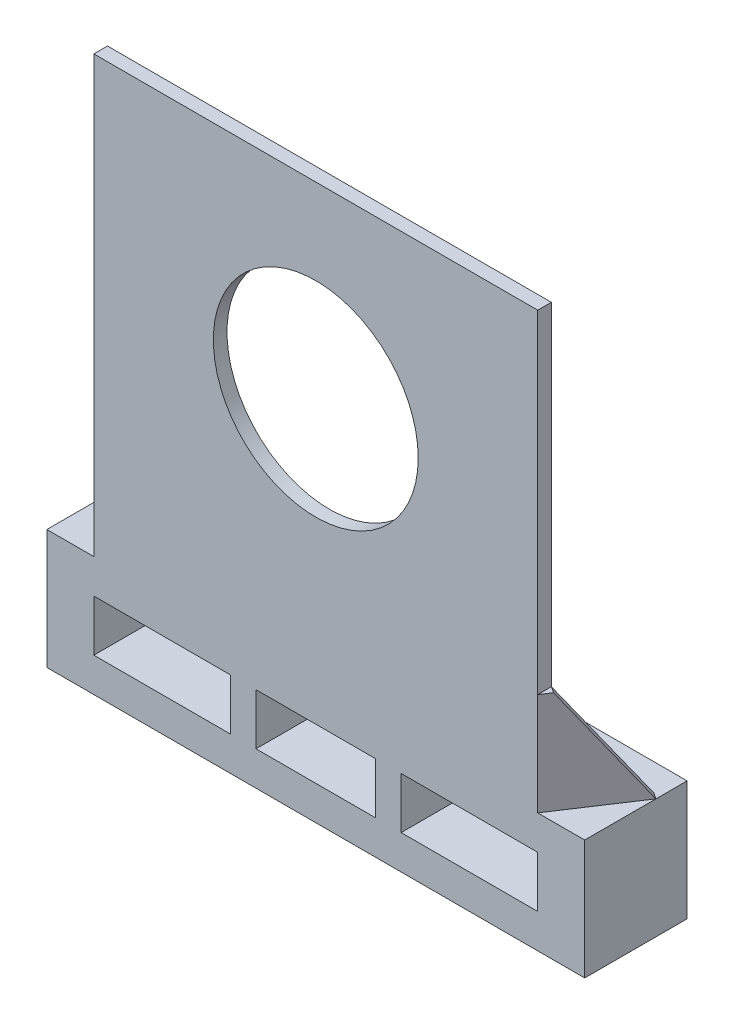
ISO-10303-21;
HEADER;
FILE_DESCRIPTION(('STEP AP214'),'2;1');
FILE_NAME('part.step','',(''),(''),'','','');
FILE_SCHEMA(('AUTOMOTIVE_DESIGN { 1 0 10303 214 1 1 1 1 }'));
ENDSEC;
DATA;
#1=APPLICATION_CONTEXT('core data for automotive mechanical design processes');
#2=APPLICATION_PROTOCOL_DEFINITION('international standard','automotive_design',2000,#1);
#3=PRODUCT_CONTEXT('',#1,'mechanical');
#4=PRODUCT('Part','Part','',(#3));
#5=PRODUCT_RELATED_PRODUCT_CATEGORY('part','',(#4));
#6=PRODUCT_DEFINITION_FORMATION('','',#4);
#7=PRODUCT_DEFINITION_CONTEXT('part definition',#1,'design');
#8=PRODUCT_DEFINITION('design','',#6,#7);
#9=PRODUCT_DEFINITION_SHAPE('','',#8);
#10=(LENGTH_UNIT() NAMED_UNIT(*) SI_UNIT(.MILLI.,.METRE.));
#11=(NAMED_UNIT(*) PLANE_ANGLE_UNIT() SI_UNIT($,.RADIAN.));
#12=(NAMED_UNIT(*) SI_UNIT($,.STERADIAN.) SOLID_ANGLE_UNIT());
#13=UNCERTAINTY_MEASURE_WITH_UNIT(LENGTH_MEASURE(1.E-05),#10,'distance_accuracy_value','');
#14=(GEOMETRIC_REPRESENTATION_CONTEXT(3) GLOBAL_UNCERTAINTY_ASSIGNED_CONTEXT((#13)) GLOBAL_UNIT_ASSIGNED_CONTEXT((#10,
#11,#12)) REPRESENTATION_CONTEXT('',''));
#15=CARTESIAN_POINT('',(0.,0.,0.));
#16=DIRECTION('',(0.,0.,1.));
#17=DIRECTION('',(1.,0.,0.));
#18=AXIS2_PLACEMENT_3D('',#15,#16,#17);
#19=CARTESIAN_POINT('',(-230.737913280798,-101.25,-54.2673490818378));
#20=DIRECTION('',(0.835164654424503,0.,-0.55));
#21=DIRECTION('',(-0.55,0.,-0.835164654424504));
#22=AXIS2_PLACEMENT_3D('',#19,#20,#21);
#23=PLANE('',#22);
#24=DIRECTION('',(0.55,0.,0.835164654424503));
#25=VECTOR('',#24,1.);
#26=CARTESIAN_POINT('',(-230.737913280798,-191.25,-54.2673490818378));
#27=LINE('',#26,#25);
#28=CARTESIAN_POINT('',(-230.737913280798,-191.25,-54.2673490818378));
#29=VERTEX_POINT('',#28);
#30=CARTESIAN_POINT('',(-195.,-191.25,0.));
#31=VERTEX_POINT('',#30);
#32=EDGE_CURVE('E208',#29,#31,#27,.T.);
#33=ORIENTED_EDGE('',*,*,#32,.F.);
#34=DIRECTION('',(0.321948241610948,0.810773184134216,0.488872348995607));
#35=VECTOR('',#34,1.);
#36=CARTESIAN_POINT('',(-207.245483192839,-132.088215949998,-18.594535889107));
#37=LINE('',#36,#35);
#38=CARTESIAN_POINT('',(-195.,-101.25,0.));
#39=VERTEX_POINT('',#38);
#40=EDGE_CURVE('E203',#29,#39,#37,.T.);
#41=ORIENTED_EDGE('',*,*,#40,.T.);
#42=DIRECTION('',(0.,-1.,0.));
#43=VECTOR('',#42,1.);
#44=CARTESIAN_POINT('',(-195.,-101.25,0.));
#45=LINE('',#44,#43);
#46=EDGE_CURVE('E320',#39,#31,#45,.T.);
#47=ORIENTED_EDGE('',*,*,#46,.T.);
#48=EDGE_LOOP('',(#33,#41,#47));
#49=FACE_BOUND('',#48,.T.);
#50=ADVANCED_FACE('F34',(#49),#23,.T.);
#51=CARTESIAN_POINT('',(-195.,-101.25,12.));
#52=DIRECTION('',(-0.835164654424503,0.,0.55));
#53=DIRECTION('',(0.55,0.,0.835164654424503));
#54=AXIS2_PLACEMENT_3D('',#51,#52,#53);
#55=PLANE('',#54);
#56=DIRECTION('',(-0.55,0.,-0.835164654424503));
#57=VECTOR('',#56,1.);
#58=CARTESIAN_POINT('',(-195.,-101.25,12.));
#59=LINE('',#58,#57);
#60=CARTESIAN_POINT('',(-195.,-101.25,12.));
#61=VERTEX_POINT('',#60);
#62=CARTESIAN_POINT('',(-200.512086719202,-101.25,3.62999999999995));
#63=VERTEX_POINT('',#62);
#64=EDGE_CURVE('E217',#61,#63,#59,.T.);
#65=ORIENTED_EDGE('',*,*,#64,.T.);
#66=DIRECTION('',(-0.321948241610948,-0.810773184134216,-0.488872348995607));
#67=VECTOR('',#66,1.);
#68=CARTESIAN_POINT('',(-200.512086719202,-101.25,3.63000000000006));
#69=LINE('',#68,#67);
#70=CARTESIAN_POINT('',(-236.25,-191.25,-50.6373490818377));
#71=VERTEX_POINT('',#70);
#72=EDGE_CURVE('E48',#63,#71,#69,.T.);
#73=ORIENTED_EDGE('',*,*,#72,.T.);
#74=DIRECTION('',(-0.55,0.,-0.835164654424503));
#75=VECTOR('',#74,1.);
#76=CARTESIAN_POINT('',(-195.,-191.25,12.));
#77=LINE('',#76,#75);
#78=CARTESIAN_POINT('',(-195.,-191.25,12.));
#79=VERTEX_POINT('',#78);
#80=EDGE_CURVE('E207',#79,#71,#77,.T.);
#81=ORIENTED_EDGE('',*,*,#80,.F.);
#82=DIRECTION('',(0.,-1.,0.));
#83=VECTOR('',#82,1.);
#84=CARTESIAN_POINT('',(-195.,-101.25,12.));
#85=LINE('',#84,#83);
#86=EDGE_CURVE('E319',#61,#79,#85,.T.);
#87=ORIENTED_EDGE('',*,*,#86,.F.);
#88=EDGE_LOOP('',(#65,#73,#81,#87));
#89=FACE_BOUND('',#88,.T.);
#90=ADVANCED_FACE('F214',(#89),#55,.T.);
#91=CARTESIAN_POINT('',(0.,-101.25,0.));
#92=DIRECTION('',(0.,-1.,0.));
#93=DIRECTION('',(0.,0.,-1.));
#94=AXIS2_PLACEMENT_3D('',#91,#92,#93);
#95=PLANE('',#94);
#96=DIRECTION('',(0.835164654424503,0.,-0.55));
#97=VECTOR('',#96,1.);
#98=CARTESIAN_POINT('',(-58.9875,-101.25,-89.571409187028));
#99=LINE('',#98,#97);
#100=EDGE_CURVE('E11',#63,#39,#99,.T.);
#101=ORIENTED_EDGE('',*,*,#100,.F.);
#102=ORIENTED_EDGE('',*,*,#64,.F.);
#103=DIRECTION('',(0.,0.,1.));
#104=VECTOR('',#103,1.);
#105=CARTESIAN_POINT('',(-195.,-101.25,0.));
#106=LINE('',#105,#104);
#107=EDGE_CURVE('E56',#39,#61,#106,.T.);
#108=ORIENTED_EDGE('',*,*,#107,.F.);
#109=EDGE_LOOP('',(#101,#102,#108));
#110=FACE_BOUND('',#109,.T.);
#111=ADVANCED_FACE('F323',(#110),#95,.F.);
#112=CARTESIAN_POINT('',(236.25,-191.25,-78.));
#113=DIRECTION('',(0.,1.,0.));
#114=DIRECTION('',(-1.,0.,0.));
#115=AXIS2_PLACEMENT_3D('',#112,#113,#114);
#116=PLANE('',#115);
#117=DIRECTION('',(0.835164654424504,0.,-0.549999999999999));
#118=VECTOR('',#117,1.);
#119=CARTESIAN_POINT('',(-236.25,-191.25,-50.6373490818377));
#120=LINE('',#119,#118);
#121=EDGE_CURVE('E200',#71,#29,#120,.T.);
#122=ORIENTED_EDGE('',*,*,#121,.T.);
#123=ORIENTED_EDGE('',*,*,#32,.T.);
#124=DIRECTION('',(1.,0.,0.));
#125=VECTOR('',#124,1.);
#126=CARTESIAN_POINT('',(195.,-191.25,0.));
#127=LINE('',#126,#125);
#128=CARTESIAN_POINT('',(195.,-191.25,0.));
#129=VERTEX_POINT('',#128);
#130=EDGE_CURVE('E270',#31,#129,#127,.T.);
#131=ORIENTED_EDGE('',*,*,#130,.T.);
#132=DIRECTION('',(-0.55,0.,0.835164654424503));
#133=VECTOR('',#132,1.);
#134=CARTESIAN_POINT('',(230.737913280798,-191.25,-54.2673490818378));
#135=LINE('',#134,#133);
#136=CARTESIAN_POINT('',(230.737913280798,-191.25,-54.2673490818378));
#137=VERTEX_POINT('',#136);
#138=EDGE_CURVE('E299',#137,#129,#135,.T.);
#139=ORIENTED_EDGE('',*,*,#138,.F.);
#140=DIRECTION('',(-0.835164654424504,0.,-0.549999999999999));
#141=VECTOR('',#140,1.);
#142=CARTESIAN_POINT('',(236.25,-191.25,-50.6373490818377));
#143=LINE('',#142,#141);
#144=CARTESIAN_POINT('',(236.25,-191.25,-50.6373490818377));
#145=VERTEX_POINT('',#144);
#146=EDGE_CURVE('E339',#145,#137,#143,.T.);
#147=ORIENTED_EDGE('',*,*,#146,.F.);
#148=DIRECTION('',(0.,0.,1.));
#149=VECTOR('',#148,1.);
#150=CARTESIAN_POINT('',(236.25,-191.25,-78.));
#151=LINE('',#150,#149);
#152=CARTESIAN_POINT('',(236.25,-191.25,-78.));
#153=VERTEX_POINT('',#152);
#154=EDGE_CURVE('E236',#153,#145,#151,.T.);
#155=ORIENTED_EDGE('',*,*,#154,.F.);
#156=DIRECTION('',(-1.,0.,0.));
#157=VECTOR('',#156,1.);
#158=CARTESIAN_POINT('',(236.25,-191.25,-78.));
#159=LINE('',#158,#157);
#160=CARTESIAN_POINT('',(-236.25,-191.25,-78.));
#161=VERTEX_POINT('',#160);
#162=EDGE_CURVE('E240',#153,#161,#159,.T.);
#163=ORIENTED_EDGE('',*,*,#162,.T.);
#164=DIRECTION('',(0.,0.,1.));
#165=VECTOR('',#164,1.);
#166=CARTESIAN_POINT('',(-236.25,-191.25,-78.));
#167=LINE('',#166,#165);
#168=EDGE_CURVE('E232',#161,#71,#167,.T.);
#169=ORIENTED_EDGE('',*,*,#168,.T.);
#170=EDGE_LOOP('',(#122,#123,#131,#139,#147,#155,#163,#169));
#171=FACE_BOUND('',#170,.T.);
#172=ADVANCED_FACE('F238',(#171),#116,.T.);
#173=CARTESIAN_POINT('',(-195.,191.25,12.));
#174=DIRECTION('',(1.,0.,0.));
#175=DIRECTION('',(0.,1.,0.));
#176=AXIS2_PLACEMENT_3D('',#173,#174,#175);
#177=PLANE('',#176);
#178=ORIENTED_EDGE('',*,*,#107,.T.);
#179=DIRECTION('',(0.,-1.,0.));
#180=VECTOR('',#179,1.);
#181=CARTESIAN_POINT('',(-195.,191.25,12.));
#182=LINE('',#181,#180);
#183=CARTESIAN_POINT('',(-195.,191.25,12.));
#184=VERTEX_POINT('',#183);
#185=EDGE_CURVE('E259',#184,#61,#182,.T.);
#186=ORIENTED_EDGE('',*,*,#185,.F.);
#187=DIRECTION('',(0.,0.,-1.));
#188=VECTOR('',#187,1.);
#189=CARTESIAN_POINT('',(-195.,191.25,12.));
#190=LINE('',#189,#188);
#191=CARTESIAN_POINT('',(-195.,191.25,0.));
#192=VERTEX_POINT('',#191);
#193=EDGE_CURVE('E268',#184,#192,#190,.T.);
#194=ORIENTED_EDGE('',*,*,#193,.T.);
#195=DIRECTION('',(0.,-1.,0.));
#196=VECTOR('',#195,1.);
#197=CARTESIAN_POINT('',(-195.,191.25,0.));
#198=LINE('',#197,#196);
#199=EDGE_CURVE('E257',#192,#39,#198,.T.);
#200=ORIENTED_EDGE('',*,*,#199,.T.);
#201=EDGE_LOOP('',(#178,#186,#194,#200));
#202=FACE_BOUND('',#201,.T.);
#203=ADVANCED_FACE('F36',(#202),#177,.F.);
#204=CARTESIAN_POINT('',(195.,191.25,12.));
#205=DIRECTION('',(-1.,0.,0.));
#206=DIRECTION('',(0.,-1.,0.));
#207=AXIS2_PLACEMENT_3D('',#204,#205,#206);
#208=PLANE('',#207);
#209=DIRECTION('',(0.,0.,1.));
#210=VECTOR('',#209,1.);
#211=CARTESIAN_POINT('',(195.,-101.25,0.));
#212=LINE('',#211,#210);
#213=CARTESIAN_POINT('',(195.,-101.25,0.));
#214=VERTEX_POINT('',#213);
#215=CARTESIAN_POINT('',(195.,-101.25,12.));
#216=VERTEX_POINT('',#215);
#217=EDGE_CURVE('E288',#214,#216,#212,.T.);
#218=ORIENTED_EDGE('',*,*,#217,.F.);
#219=DIRECTION('',(0.,1.,0.));
#220=VECTOR('',#219,1.);
#221=CARTESIAN_POINT('',(195.,191.25,0.));
#222=LINE('',#221,#220);
#223=CARTESIAN_POINT('',(195.,191.25,0.));
#224=VERTEX_POINT('',#223);
#225=EDGE_CURVE('E273',#214,#224,#222,.T.);
#226=ORIENTED_EDGE('',*,*,#225,.T.);
#227=DIRECTION('',(0.,0.,-1.));
#228=VECTOR('',#227,1.);
#229=CARTESIAN_POINT('',(195.,191.25,12.));
#230=LINE('',#229,#228);
#231=CARTESIAN_POINT('',(195.,191.25,12.));
#232=VERTEX_POINT('',#231);
#233=EDGE_CURVE('E280',#232,#224,#230,.T.);
#234=ORIENTED_EDGE('',*,*,#233,.F.);
#235=DIRECTION('',(0.,1.,0.));
#236=VECTOR('',#235,1.);
#237=CARTESIAN_POINT('',(195.,191.25,12.));
#238=LINE('',#237,#236);
#239=EDGE_CURVE('E261',#216,#232,#238,.T.);
#240=ORIENTED_EDGE('',*,*,#239,.F.);
#241=EDGE_LOOP('',(#218,#226,#234,#240));
#242=FACE_BOUND('',#241,.T.);
#243=ADVANCED_FACE('F304',(#242),#208,.F.);
#244=CARTESIAN_POINT('',(236.25,-191.25,12.));
#245=VERTEX_POINT('',#244);
#246=EDGE_CURVE('E251',#145,#245,#151,.T.);
#247=ORIENTED_EDGE('',*,*,#246,.F.);
#248=DIRECTION('',(0.55,0.,-0.835164654424503));
#249=VECTOR('',#248,1.);
#250=CARTESIAN_POINT('',(195.,-191.25,12.));
#251=LINE('',#250,#249);
#252=CARTESIAN_POINT('',(195.,-191.25,12.));
#253=VERTEX_POINT('',#252);
#254=EDGE_CURVE('E333',#253,#145,#251,.T.);
#255=ORIENTED_EDGE('',*,*,#254,.F.);
#256=DIRECTION('',(-1.,0.,0.));
#257=VECTOR('',#256,1.);
#258=CARTESIAN_POINT('',(236.25,-191.25,12.));
#259=LINE('',#258,#257);
#260=EDGE_CURVE('E247',#245,#253,#259,.T.);
#261=ORIENTED_EDGE('',*,*,#260,.F.);
#262=EDGE_LOOP('',(#247,#255,#261));
#263=FACE_BOUND('',#262,.T.);
#264=ADVANCED_FACE('F457',(#263),#116,.T.);
#265=ORIENTED_EDGE('',*,*,#80,.T.);
#266=CARTESIAN_POINT('',(-236.25,-191.25,12.));
#267=VERTEX_POINT('',#266);
#268=EDGE_CURVE('E223',#71,#267,#167,.T.);
#269=ORIENTED_EDGE('',*,*,#268,.T.);
#270=EDGE_CURVE('E225',#79,#267,#259,.T.);
#271=ORIENTED_EDGE('',*,*,#270,.F.);
#272=EDGE_LOOP('',(#265,#269,#271));
#273=FACE_BOUND('',#272,.T.);
#274=ADVANCED_FACE('F222',(#273),#116,.T.);
#275=CARTESIAN_POINT('',(0.,0.,12.));
#276=DIRECTION('',(0.,0.,-1.));
#277=DIRECTION('',(-1.,0.,0.));
#278=AXIS2_PLACEMENT_3D('',#275,#276,#277);
#279=PLANE('',#278);
#280=ORIENTED_EDGE('',*,*,#185,.T.);
#281=ORIENTED_EDGE('',*,*,#86,.T.);
#282=ORIENTED_EDGE('',*,*,#270,.T.);
#283=DIRECTION('',(0.,-1.,0.));
#284=VECTOR('',#283,1.);
#285=CARTESIAN_POINT('',(-236.25,-191.25,12.));
#286=LINE('',#285,#284);
#287=CARTESIAN_POINT('',(-236.25,-296.25,12.));
#288=VERTEX_POINT('',#287);
#289=EDGE_CURVE('E235',#267,#288,#286,.T.);
#290=ORIENTED_EDGE('',*,*,#289,.T.);
#291=DIRECTION('',(1.,0.,0.));
#292=VECTOR('',#291,1.);
#293=CARTESIAN_POINT('',(236.25,-296.25,12.));
#294=LINE('',#293,#292);
#295=CARTESIAN_POINT('',(236.25,-296.25,12.));
#296=VERTEX_POINT('',#295);
#297=EDGE_CURVE('E447',#288,#296,#294,.T.);
#298=ORIENTED_EDGE('',*,*,#297,.T.);
#299=DIRECTION('',(0.,1.,0.));
#300=VECTOR('',#299,1.);
#301=CARTESIAN_POINT('',(236.25,-191.25,12.));
#302=LINE('',#301,#300);
#303=EDGE_CURVE('E449',#296,#245,#302,.T.);
#304=ORIENTED_EDGE('',*,*,#303,.T.);
#305=ORIENTED_EDGE('',*,*,#260,.T.);
#306=EDGE_CURVE('E263',#253,#216,#238,.T.);
#307=ORIENTED_EDGE('',*,*,#306,.T.);
#308=ORIENTED_EDGE('',*,*,#239,.T.);
#309=DIRECTION('',(-1.,0.,0.));
#310=VECTOR('',#309,1.);
#311=CARTESIAN_POINT('',(195.,191.25,12.));
#312=LINE('',#311,#310);
#313=EDGE_CURVE('E266',#232,#184,#312,.T.);
#314=ORIENTED_EDGE('',*,*,#313,.T.);
#315=EDGE_LOOP('',(#280,#281,#282,#290,#298,#304,#305,#307,#308,#314));
#316=FACE_BOUND('',#315,.T.);
#317=CARTESIAN_POINT('',(0.,26.2499999999999,12.));
#318=DIRECTION('',(0.,0.,1.));
#319=DIRECTION('',(1.,0.,0.));
#320=AXIS2_PLACEMENT_3D('',#317,#318,#319);
#321=CIRCLE('',#320,90.);
#322=CARTESIAN_POINT('',(90.,26.2499999999999,12.));
#323=VERTEX_POINT('',#322);
#324=EDGE_CURVE('E243',#323,#323,#321,.T.);
#325=ORIENTED_EDGE('',*,*,#324,.F.);
#326=EDGE_LOOP('',(#325));
#327=FACE_BOUND('',#326,.T.);
#328=DIRECTION('',(1.,0.,0.));
#329=VECTOR('',#328,1.);
#330=CARTESIAN_POINT('',(-75.,-266.25,12.));
#331=LINE('',#330,#329);
#332=CARTESIAN_POINT('',(-195.,-266.25,12.));
#333=VERTEX_POINT('',#332);
#334=CARTESIAN_POINT('',(-75.,-266.25,12.));
#335=VERTEX_POINT('',#334);
#336=EDGE_CURVE('E357',#333,#335,#331,.T.);
#337=ORIENTED_EDGE('',*,*,#336,.F.);
#338=DIRECTION('',(0.,-1.,0.));
#339=VECTOR('',#338,1.);
#340=CARTESIAN_POINT('',(-195.,-221.25,12.));
#341=LINE('',#340,#339);
#342=CARTESIAN_POINT('',(-195.,-221.25,12.));
#343=VERTEX_POINT('',#342);
#344=EDGE_CURVE('E336',#343,#333,#341,.T.);
#345=ORIENTED_EDGE('',*,*,#344,.F.);
#346=DIRECTION('',(-1.,0.,0.));
#347=VECTOR('',#346,1.);
#348=CARTESIAN_POINT('',(-75.,-221.25,12.));
#349=LINE('',#348,#347);
#350=CARTESIAN_POINT('',(-75.,-221.25,12.));
#351=VERTEX_POINT('',#350);
#352=EDGE_CURVE('E346',#351,#343,#349,.T.);
#353=ORIENTED_EDGE('',*,*,#352,.F.);
#354=DIRECTION('',(0.,1.,0.));
#355=VECTOR('',#354,1.);
#356=CARTESIAN_POINT('',(-75.,-221.25,12.));
#357=LINE('',#356,#355);
#358=EDGE_CURVE('E360',#335,#351,#357,.T.);
#359=ORIENTED_EDGE('',*,*,#358,.F.);
#360=EDGE_LOOP('',(#337,#345,#353,#359));
#361=FACE_BOUND('',#360,.T.);
#362=DIRECTION('',(1.,0.,0.));
#363=VECTOR('',#362,1.);
#364=CARTESIAN_POINT('',(52.5,-266.25,12.));
#365=LINE('',#364,#363);
#366=CARTESIAN_POINT('',(-52.5,-266.25,12.));
#367=VERTEX_POINT('',#366);
#368=CARTESIAN_POINT('',(52.5,-266.25,12.));
#369=VERTEX_POINT('',#368);
#370=EDGE_CURVE('E389',#367,#369,#365,.T.);
#371=ORIENTED_EDGE('',*,*,#370,.F.);
#372=DIRECTION('',(0.,-1.,0.));
#373=VECTOR('',#372,1.);
#374=CARTESIAN_POINT('',(-52.5,-221.25,12.));
#375=LINE('',#374,#373);
#376=CARTESIAN_POINT('',(-52.5,-221.25,12.));
#377=VERTEX_POINT('',#376);
#378=EDGE_CURVE('E367',#377,#367,#375,.T.);
#379=ORIENTED_EDGE('',*,*,#378,.F.);
#380=DIRECTION('',(-1.,0.,0.));
#381=VECTOR('',#380,1.);
#382=CARTESIAN_POINT('',(52.5,-221.25,12.));
#383=LINE('',#382,#381);
#384=CARTESIAN_POINT('',(52.5,-221.25,12.));
#385=VERTEX_POINT('',#384);
#386=EDGE_CURVE('E378',#385,#377,#383,.T.);
#387=ORIENTED_EDGE('',*,*,#386,.F.);
#388=DIRECTION('',(0.,1.,0.));
#389=VECTOR('',#388,1.);
#390=CARTESIAN_POINT('',(52.5,-221.25,12.));
#391=LINE('',#390,#389);
#392=EDGE_CURVE('E392',#369,#385,#391,.T.);
#393=ORIENTED_EDGE('',*,*,#392,.F.);
#394=EDGE_LOOP('',(#371,#379,#387,#393));
#395=FACE_BOUND('',#394,.T.);
#396=DIRECTION('',(1.,0.,0.));
#397=VECTOR('',#396,1.);
#398=CARTESIAN_POINT('',(195.,-266.25,12.));
#399=LINE('',#398,#397);
#400=CARTESIAN_POINT('',(75.,-266.25,12.));
#401=VERTEX_POINT('',#400);
#402=CARTESIAN_POINT('',(195.,-266.25,12.));
#403=VERTEX_POINT('',#402);
#404=EDGE_CURVE('E421',#401,#403,#399,.T.);
#405=ORIENTED_EDGE('',*,*,#404,.F.);
#406=DIRECTION('',(0.,-1.,0.));
#407=VECTOR('',#406,1.);
#408=CARTESIAN_POINT('',(75.,-221.25,12.));
#409=LINE('',#408,#407);
#410=CARTESIAN_POINT('',(75.,-221.25,12.));
#411=VERTEX_POINT('',#410);
#412=EDGE_CURVE('E399',#411,#401,#409,.T.);
#413=ORIENTED_EDGE('',*,*,#412,.F.);
#414=DIRECTION('',(-1.,0.,0.));
#415=VECTOR('',#414,1.);
#416=CARTESIAN_POINT('',(195.,-221.25,12.));
#417=LINE('',#416,#415);
#418=CARTESIAN_POINT('',(195.,-221.25,12.));
#419=VERTEX_POINT('',#418);
#420=EDGE_CURVE('E410',#419,#411,#417,.T.);
#421=ORIENTED_EDGE('',*,*,#420,.F.);
#422=DIRECTION('',(0.,1.,0.));
#423=VECTOR('',#422,1.);
#424=CARTESIAN_POINT('',(195.,-221.25,12.));
#425=LINE('',#424,#423);
#426=EDGE_CURVE('E424',#403,#419,#425,.T.);
#427=ORIENTED_EDGE('',*,*,#426,.F.);
#428=EDGE_LOOP('',(#405,#413,#421,#427));
#429=FACE_BOUND('',#428,.T.);
#430=ADVANCED_FACE('F317',(#316,#327,#361,#395,#429),#279,.F.);
#431=CARTESIAN_POINT('',(0.,0.,0.));
#432=DIRECTION('',(0.,0.,-1.));
#433=DIRECTION('',(-1.,0.,0.));
#434=AXIS2_PLACEMENT_3D('',#431,#432,#433);
#435=PLANE('',#434);
#436=ORIENTED_EDGE('',*,*,#199,.F.);
#437=DIRECTION('',(-1.,0.,0.));
#438=VECTOR('',#437,1.);
#439=CARTESIAN_POINT('',(195.,191.25,0.));
#440=LINE('',#439,#438);
#441=EDGE_CURVE('E262',#224,#192,#440,.T.);
#442=ORIENTED_EDGE('',*,*,#441,.F.);
#443=ORIENTED_EDGE('',*,*,#225,.F.);
#444=EDGE_CURVE('E274',#129,#214,#222,.T.);
#445=ORIENTED_EDGE('',*,*,#444,.F.);
#446=ORIENTED_EDGE('',*,*,#130,.F.);
#447=ORIENTED_EDGE('',*,*,#46,.F.);
#448=EDGE_LOOP('',(#436,#442,#443,#445,#446,#447));
#449=FACE_BOUND('',#448,.T.);
#450=CARTESIAN_POINT('',(0.,26.2499999999999,0.));
#451=DIRECTION('',(0.,0.,1.));
#452=DIRECTION('',(1.,0.,0.));
#453=AXIS2_PLACEMENT_3D('',#450,#451,#452);
#454=CIRCLE('',#453,90.);
#455=CARTESIAN_POINT('',(90.,26.2499999999999,0.));
#456=VERTEX_POINT('',#455);
#457=EDGE_CURVE('E241',#456,#456,#454,.T.);
#458=ORIENTED_EDGE('',*,*,#457,.T.);
#459=EDGE_LOOP('',(#458));
#460=FACE_BOUND('',#459,.T.);
#461=ADVANCED_FACE('F309',(#449,#460),#435,.T.);
#462=CARTESIAN_POINT('',(195.,191.25,12.));
#463=DIRECTION('',(0.,-1.,0.));
#464=DIRECTION('',(1.,0.,0.));
#465=AXIS2_PLACEMENT_3D('',#462,#463,#464);
#466=PLANE('',#465);
#467=ORIENTED_EDGE('',*,*,#441,.T.);
#468=ORIENTED_EDGE('',*,*,#193,.F.);
#469=ORIENTED_EDGE('',*,*,#313,.F.);
#470=ORIENTED_EDGE('',*,*,#233,.T.);
#471=EDGE_LOOP('',(#467,#468,#469,#470));
#472=FACE_BOUND('',#471,.T.);
#473=ADVANCED_FACE('F314',(#472),#466,.F.);
#474=CARTESIAN_POINT('',(0.,26.2499999999999,12.));
#475=DIRECTION('',(0.,0.,-1.));
#476=DIRECTION('',(-1.,0.,0.));
#477=AXIS2_PLACEMENT_3D('',#474,#475,#476);
#478=CYLINDRICAL_SURFACE('',#477,90.);
#479=ORIENTED_EDGE('',*,*,#324,.T.);
#480=EDGE_LOOP('',(#479));
#481=FACE_BOUND('',#480,.T.);
#482=ORIENTED_EDGE('',*,*,#457,.F.);
#483=EDGE_LOOP('',(#482));
#484=FACE_BOUND('',#483,.T.);
#485=ADVANCED_FACE('F498',(#481,#484),#478,.F.);
#486=CARTESIAN_POINT('',(-236.25,-191.25,-78.));
#487=DIRECTION('',(-1.,0.,0.));
#488=DIRECTION('',(0.,0.,1.));
#489=AXIS2_PLACEMENT_3D('',#486,#487,#488);
#490=PLANE('',#489);
#491=ORIENTED_EDGE('',*,*,#289,.F.);
#492=ORIENTED_EDGE('',*,*,#268,.F.);
#493=ORIENTED_EDGE('',*,*,#168,.F.);
#494=DIRECTION('',(0.,-1.,0.));
#495=VECTOR('',#494,1.);
#496=CARTESIAN_POINT('',(-236.25,-191.25,-78.));
#497=LINE('',#496,#495);
#498=CARTESIAN_POINT('',(-236.25,-296.25,-78.));
#499=VERTEX_POINT('',#498);
#500=EDGE_CURVE('E437',#161,#499,#497,.T.);
#501=ORIENTED_EDGE('',*,*,#500,.T.);
#502=DIRECTION('',(0.,0.,1.));
#503=VECTOR('',#502,1.);
#504=CARTESIAN_POINT('',(-236.25,-296.25,-78.));
#505=LINE('',#504,#503);
#506=EDGE_CURVE('E254',#499,#288,#505,.T.);
#507=ORIENTED_EDGE('',*,*,#506,.T.);
#508=EDGE_LOOP('',(#491,#492,#493,#501,#507));
#509=FACE_BOUND('',#508,.T.);
#510=ADVANCED_FACE('F230',(#509),#490,.T.);
#511=CARTESIAN_POINT('',(236.25,-191.25,-78.));
#512=DIRECTION('',(1.,0.,0.));
#513=DIRECTION('',(0.,0.,-1.));
#514=AXIS2_PLACEMENT_3D('',#511,#512,#513);
#515=PLANE('',#514);
#516=ORIENTED_EDGE('',*,*,#303,.F.);
#517=DIRECTION('',(0.,0.,1.));
#518=VECTOR('',#517,1.);
#519=CARTESIAN_POINT('',(236.25,-296.25,-78.));
#520=LINE('',#519,#518);
#521=CARTESIAN_POINT('',(236.25,-296.25,-78.));
#522=VERTEX_POINT('',#521);
#523=EDGE_CURVE('E252',#522,#296,#520,.T.);
#524=ORIENTED_EDGE('',*,*,#523,.F.);
#525=DIRECTION('',(0.,1.,0.));
#526=VECTOR('',#525,1.);
#527=CARTESIAN_POINT('',(236.25,-191.25,-78.));
#528=LINE('',#527,#526);
#529=EDGE_CURVE('E442',#522,#153,#528,.T.);
#530=ORIENTED_EDGE('',*,*,#529,.T.);
#531=ORIENTED_EDGE('',*,*,#154,.T.);
#532=ORIENTED_EDGE('',*,*,#246,.T.);
#533=EDGE_LOOP('',(#516,#524,#530,#531,#532));
#534=FACE_BOUND('',#533,.T.);
#535=ADVANCED_FACE('F508',(#534),#515,.T.);
#536=CARTESIAN_POINT('',(236.25,-296.25,-78.));
#537=DIRECTION('',(0.,-1.,0.));
#538=DIRECTION('',(1.,0.,0.));
#539=AXIS2_PLACEMENT_3D('',#536,#537,#538);
#540=PLANE('',#539);
#541=ORIENTED_EDGE('',*,*,#297,.F.);
#542=ORIENTED_EDGE('',*,*,#506,.F.);
#543=DIRECTION('',(1.,0.,0.));
#544=VECTOR('',#543,1.);
#545=CARTESIAN_POINT('',(236.25,-296.25,-78.));
#546=LINE('',#545,#544);
#547=EDGE_CURVE('E439',#499,#522,#546,.T.);
#548=ORIENTED_EDGE('',*,*,#547,.T.);
#549=ORIENTED_EDGE('',*,*,#523,.T.);
#550=EDGE_LOOP('',(#541,#542,#548,#549));
#551=FACE_BOUND('',#550,.T.);
#552=ADVANCED_FACE('F509',(#551),#540,.T.);
#553=CARTESIAN_POINT('',(0.,0.,-78.));
#554=DIRECTION('',(0.,0.,-1.));
#555=DIRECTION('',(-1.,0.,0.));
#556=AXIS2_PLACEMENT_3D('',#553,#554,#555);
#557=PLANE('',#556);
#558=DIRECTION('',(0.,-1.,0.));
#559=VECTOR('',#558,1.);
#560=CARTESIAN_POINT('',(-195.,-221.25,-78.));
#561=LINE('',#560,#559);
#562=CARTESIAN_POINT('',(-195.,-221.25,-78.));
#563=VERTEX_POINT('',#562);
#564=CARTESIAN_POINT('',(-195.,-266.25,-78.));
#565=VERTEX_POINT('',#564);
#566=EDGE_CURVE('E342',#563,#565,#561,.T.);
#567=ORIENTED_EDGE('',*,*,#566,.T.);
#568=DIRECTION('',(1.,0.,0.));
#569=VECTOR('',#568,1.);
#570=CARTESIAN_POINT('',(-75.,-266.25,-78.));
#571=LINE('',#570,#569);
#572=CARTESIAN_POINT('',(-75.,-266.25,-78.));
#573=VERTEX_POINT('',#572);
#574=EDGE_CURVE('E345',#565,#573,#571,.T.);
#575=ORIENTED_EDGE('',*,*,#574,.T.);
#576=DIRECTION('',(0.,1.,0.));
#577=VECTOR('',#576,1.);
#578=CARTESIAN_POINT('',(-75.,-221.25,-78.));
#579=LINE('',#578,#577);
#580=CARTESIAN_POINT('',(-75.,-221.25,-78.));
#581=VERTEX_POINT('',#580);
#582=EDGE_CURVE('E349',#573,#581,#579,.T.);
#583=ORIENTED_EDGE('',*,*,#582,.T.);
#584=DIRECTION('',(-1.,0.,0.));
#585=VECTOR('',#584,1.);
#586=CARTESIAN_POINT('',(-75.,-221.25,-78.));
#587=LINE('',#586,#585);
#588=EDGE_CURVE('E352',#581,#563,#587,.T.);
#589=ORIENTED_EDGE('',*,*,#588,.T.);
#590=EDGE_LOOP('',(#567,#575,#583,#589));
#591=FACE_BOUND('',#590,.T.);
#592=DIRECTION('',(0.,-1.,0.));
#593=VECTOR('',#592,1.);
#594=CARTESIAN_POINT('',(-52.5,-221.25,-78.));
#595=LINE('',#594,#593);
#596=CARTESIAN_POINT('',(-52.5,-221.25,-78.));
#597=VERTEX_POINT('',#596);
#598=CARTESIAN_POINT('',(-52.5,-266.25,-78.));
#599=VERTEX_POINT('',#598);
#600=EDGE_CURVE('E374',#597,#599,#595,.T.);
#601=ORIENTED_EDGE('',*,*,#600,.T.);
#602=DIRECTION('',(1.,0.,0.));
#603=VECTOR('',#602,1.);
#604=CARTESIAN_POINT('',(52.5,-266.25,-78.));
#605=LINE('',#604,#603);
#606=CARTESIAN_POINT('',(52.5,-266.25,-78.));
#607=VERTEX_POINT('',#606);
#608=EDGE_CURVE('E377',#599,#607,#605,.T.);
#609=ORIENTED_EDGE('',*,*,#608,.T.);
#610=DIRECTION('',(0.,1.,0.));
#611=VECTOR('',#610,1.);
#612=CARTESIAN_POINT('',(52.5,-221.25,-78.));
#613=LINE('',#612,#611);
#614=CARTESIAN_POINT('',(52.5,-221.25,-78.));
#615=VERTEX_POINT('',#614);
#616=EDGE_CURVE('E381',#607,#615,#613,.T.);
#617=ORIENTED_EDGE('',*,*,#616,.T.);
#618=DIRECTION('',(-1.,0.,0.));
#619=VECTOR('',#618,1.);
#620=CARTESIAN_POINT('',(52.5,-221.25,-78.));
#621=LINE('',#620,#619);
#622=EDGE_CURVE('E384',#615,#597,#621,.T.);
#623=ORIENTED_EDGE('',*,*,#622,.T.);
#624=EDGE_LOOP('',(#601,#609,#617,#623));
#625=FACE_BOUND('',#624,.T.);
#626=DIRECTION('',(0.,-1.,0.));
#627=VECTOR('',#626,1.);
#628=CARTESIAN_POINT('',(75.,-221.25,-78.));
#629=LINE('',#628,#627);
#630=CARTESIAN_POINT('',(75.,-221.25,-78.));
#631=VERTEX_POINT('',#630);
#632=CARTESIAN_POINT('',(75.,-266.25,-78.));
#633=VERTEX_POINT('',#632);
#634=EDGE_CURVE('E406',#631,#633,#629,.T.);
#635=ORIENTED_EDGE('',*,*,#634,.T.);
#636=DIRECTION('',(1.,0.,0.));
#637=VECTOR('',#636,1.);
#638=CARTESIAN_POINT('',(195.,-266.25,-78.));
#639=LINE('',#638,#637);
#640=CARTESIAN_POINT('',(195.,-266.25,-78.));
#641=VERTEX_POINT('',#640);
#642=EDGE_CURVE('E409',#633,#641,#639,.T.);
#643=ORIENTED_EDGE('',*,*,#642,.T.);
#644=DIRECTION('',(0.,1.,0.));
#645=VECTOR('',#644,1.);
#646=CARTESIAN_POINT('',(195.,-221.25,-78.));
#647=LINE('',#646,#645);
#648=CARTESIAN_POINT('',(195.,-221.25,-78.));
#649=VERTEX_POINT('',#648);
#650=EDGE_CURVE('E413',#641,#649,#647,.T.);
#651=ORIENTED_EDGE('',*,*,#650,.T.);
#652=DIRECTION('',(-1.,0.,0.));
#653=VECTOR('',#652,1.);
#654=CARTESIAN_POINT('',(195.,-221.25,-78.));
#655=LINE('',#654,#653);
#656=EDGE_CURVE('E416',#649,#631,#655,.T.);
#657=ORIENTED_EDGE('',*,*,#656,.T.);
#658=EDGE_LOOP('',(#635,#643,#651,#657));
#659=FACE_BOUND('',#658,.T.);
#660=ORIENTED_EDGE('',*,*,#500,.F.);
#661=ORIENTED_EDGE('',*,*,#162,.F.);
#662=ORIENTED_EDGE('',*,*,#529,.F.);
#663=ORIENTED_EDGE('',*,*,#547,.F.);
#664=EDGE_LOOP('',(#660,#661,#662,#663));
#665=FACE_BOUND('',#664,.T.);
#666=ADVANCED_FACE('F511',(#591,#625,#659,#665),#557,.T.);
#667=CARTESIAN_POINT('',(75.,-221.25,-78.));
#668=DIRECTION('',(-1.,0.,0.));
#669=DIRECTION('',(0.,-1.,0.));
#670=AXIS2_PLACEMENT_3D('',#667,#668,#669);
#671=PLANE('',#670);
#672=ORIENTED_EDGE('',*,*,#412,.T.);
#673=DIRECTION('',(0.,0.,1.));
#674=VECTOR('',#673,1.);
#675=CARTESIAN_POINT('',(75.,-266.25,-78.));
#676=LINE('',#675,#674);
#677=EDGE_CURVE('E419',#633,#401,#676,.T.);
#678=ORIENTED_EDGE('',*,*,#677,.F.);
#679=ORIENTED_EDGE('',*,*,#634,.F.);
#680=DIRECTION('',(0.,0.,1.));
#681=VECTOR('',#680,1.);
#682=CARTESIAN_POINT('',(75.,-221.25,-78.));
#683=LINE('',#682,#681);
#684=EDGE_CURVE('E429',#631,#411,#683,.T.);
#685=ORIENTED_EDGE('',*,*,#684,.T.);
#686=EDGE_LOOP('',(#672,#678,#679,#685));
#687=FACE_BOUND('',#686,.T.);
#688=ADVANCED_FACE('F522',(#687),#671,.F.);
#689=CARTESIAN_POINT('',(195.,-221.25,-78.));
#690=DIRECTION('',(0.,1.,0.));
#691=DIRECTION('',(0.,0.,1.));
#692=AXIS2_PLACEMENT_3D('',#689,#690,#691);
#693=PLANE('',#692);
#694=ORIENTED_EDGE('',*,*,#420,.T.);
#695=ORIENTED_EDGE('',*,*,#684,.F.);
#696=ORIENTED_EDGE('',*,*,#656,.F.);
#697=DIRECTION('',(0.,0.,1.));
#698=VECTOR('',#697,1.);
#699=CARTESIAN_POINT('',(195.,-221.25,-78.));
#700=LINE('',#699,#698);
#701=EDGE_CURVE('E431',#649,#419,#700,.T.);
#702=ORIENTED_EDGE('',*,*,#701,.T.);
#703=EDGE_LOOP('',(#694,#695,#696,#702));
#704=FACE_BOUND('',#703,.T.);
#705=ADVANCED_FACE('F527',(#704),#693,.F.);
#706=CARTESIAN_POINT('',(195.,-221.25,-78.));
#707=DIRECTION('',(1.,0.,0.));
#708=DIRECTION('',(0.,1.,0.));
#709=AXIS2_PLACEMENT_3D('',#706,#707,#708);
#710=PLANE('',#709);
#711=ORIENTED_EDGE('',*,*,#426,.T.);
#712=ORIENTED_EDGE('',*,*,#701,.F.);
#713=ORIENTED_EDGE('',*,*,#650,.F.);
#714=DIRECTION('',(0.,0.,1.));
#715=VECTOR('',#714,1.);
#716=CARTESIAN_POINT('',(195.,-266.25,-78.));
#717=LINE('',#716,#715);
#718=EDGE_CURVE('E433',#641,#403,#717,.T.);
#719=ORIENTED_EDGE('',*,*,#718,.T.);
#720=EDGE_LOOP('',(#711,#712,#713,#719));
#721=FACE_BOUND('',#720,.T.);
#722=ADVANCED_FACE('F536',(#721),#710,.F.);
#723=CARTESIAN_POINT('',(195.,-266.25,-78.));
#724=DIRECTION('',(0.,-1.,0.));
#725=DIRECTION('',(1.,0.,0.));
#726=AXIS2_PLACEMENT_3D('',#723,#724,#725);
#727=PLANE('',#726);
#728=ORIENTED_EDGE('',*,*,#404,.T.);
#729=ORIENTED_EDGE('',*,*,#718,.F.);
#730=ORIENTED_EDGE('',*,*,#642,.F.);
#731=ORIENTED_EDGE('',*,*,#677,.T.);
#732=EDGE_LOOP('',(#728,#729,#730,#731));
#733=FACE_BOUND('',#732,.T.);
#734=ADVANCED_FACE('F532',(#733),#727,.F.);
#735=CARTESIAN_POINT('',(-52.5,-221.25,-78.));
#736=DIRECTION('',(-1.,0.,0.));
#737=DIRECTION('',(0.,-1.,0.));
#738=AXIS2_PLACEMENT_3D('',#735,#736,#737);
#739=PLANE('',#738);
#740=ORIENTED_EDGE('',*,*,#378,.T.);
#741=DIRECTION('',(0.,0.,1.));
#742=VECTOR('',#741,1.);
#743=CARTESIAN_POINT('',(-52.5,-266.25,-78.));
#744=LINE('',#743,#742);
#745=EDGE_CURVE('E387',#599,#367,#744,.T.);
#746=ORIENTED_EDGE('',*,*,#745,.F.);
#747=ORIENTED_EDGE('',*,*,#600,.F.);
#748=DIRECTION('',(0.,0.,1.));
#749=VECTOR('',#748,1.);
#750=CARTESIAN_POINT('',(-52.5,-221.25,-78.));
#751=LINE('',#750,#749);
#752=EDGE_CURVE('E397',#597,#377,#751,.T.);
#753=ORIENTED_EDGE('',*,*,#752,.T.);
#754=EDGE_LOOP('',(#740,#746,#747,#753));
#755=FACE_BOUND('',#754,.T.);
#756=ADVANCED_FACE('F535',(#755),#739,.F.);
#757=CARTESIAN_POINT('',(52.5,-221.25,-78.));
#758=DIRECTION('',(0.,1.,0.));
#759=DIRECTION('',(0.,0.,1.));
#760=AXIS2_PLACEMENT_3D('',#757,#758,#759);
#761=PLANE('',#760);
#762=ORIENTED_EDGE('',*,*,#386,.T.);
#763=ORIENTED_EDGE('',*,*,#752,.F.);
#764=ORIENTED_EDGE('',*,*,#622,.F.);
#765=DIRECTION('',(0.,0.,1.));
#766=VECTOR('',#765,1.);
#767=CARTESIAN_POINT('',(52.5,-221.25,-78.));
#768=LINE('',#767,#766);
#769=EDGE_CURVE('E400',#615,#385,#768,.T.);
#770=ORIENTED_EDGE('',*,*,#769,.T.);
#771=EDGE_LOOP('',(#762,#763,#764,#770));
#772=FACE_BOUND('',#771,.T.);
#773=ADVANCED_FACE('F546',(#772),#761,.F.);
#774=CARTESIAN_POINT('',(52.5,-221.25,-78.));
#775=DIRECTION('',(1.,0.,0.));
#776=DIRECTION('',(0.,1.,0.));
#777=AXIS2_PLACEMENT_3D('',#774,#775,#776);
#778=PLANE('',#777);
#779=ORIENTED_EDGE('',*,*,#392,.T.);
#780=ORIENTED_EDGE('',*,*,#769,.F.);
#781=ORIENTED_EDGE('',*,*,#616,.F.);
#782=DIRECTION('',(0.,0.,1.));
#783=VECTOR('',#782,1.);
#784=CARTESIAN_POINT('',(52.5,-266.25,-78.));
#785=LINE('',#784,#783);
#786=EDGE_CURVE('E402',#607,#369,#785,.T.);
#787=ORIENTED_EDGE('',*,*,#786,.T.);
#788=EDGE_LOOP('',(#779,#780,#781,#787));
#789=FACE_BOUND('',#788,.T.);
#790=ADVANCED_FACE('F552',(#789),#778,.F.);
#791=CARTESIAN_POINT('',(52.5,-266.25,-78.));
#792=DIRECTION('',(0.,-1.,0.));
#793=DIRECTION('',(0.,0.,-1.));
#794=AXIS2_PLACEMENT_3D('',#791,#792,#793);
#795=PLANE('',#794);
#796=ORIENTED_EDGE('',*,*,#370,.T.);
#797=ORIENTED_EDGE('',*,*,#786,.F.);
#798=ORIENTED_EDGE('',*,*,#608,.F.);
#799=ORIENTED_EDGE('',*,*,#745,.T.);
#800=EDGE_LOOP('',(#796,#797,#798,#799));
#801=FACE_BOUND('',#800,.T.);
#802=ADVANCED_FACE('F548',(#801),#795,.F.);
#803=CARTESIAN_POINT('',(-195.,-221.25,-78.));
#804=DIRECTION('',(-1.,0.,0.));
#805=DIRECTION('',(0.,0.,1.));
#806=AXIS2_PLACEMENT_3D('',#803,#804,#805);
#807=PLANE('',#806);
#808=ORIENTED_EDGE('',*,*,#344,.T.);
#809=DIRECTION('',(0.,0.,1.));
#810=VECTOR('',#809,1.);
#811=CARTESIAN_POINT('',(-195.,-266.25,-78.));
#812=LINE('',#811,#810);
#813=EDGE_CURVE('E355',#565,#333,#812,.T.);
#814=ORIENTED_EDGE('',*,*,#813,.F.);
#815=ORIENTED_EDGE('',*,*,#566,.F.);
#816=DIRECTION('',(0.,0.,1.));
#817=VECTOR('',#816,1.);
#818=CARTESIAN_POINT('',(-195.,-221.25,-78.));
#819=LINE('',#818,#817);
#820=EDGE_CURVE('E365',#563,#343,#819,.T.);
#821=ORIENTED_EDGE('',*,*,#820,.T.);
#822=EDGE_LOOP('',(#808,#814,#815,#821));
#823=FACE_BOUND('',#822,.T.);
#824=ADVANCED_FACE('F551',(#823),#807,.F.);
#825=CARTESIAN_POINT('',(-75.,-221.25,-78.));
#826=DIRECTION('',(0.,1.,0.));
#827=DIRECTION('',(-1.,0.,0.));
#828=AXIS2_PLACEMENT_3D('',#825,#826,#827);
#829=PLANE('',#828);
#830=ORIENTED_EDGE('',*,*,#352,.T.);
#831=ORIENTED_EDGE('',*,*,#820,.F.);
#832=ORIENTED_EDGE('',*,*,#588,.F.);
#833=DIRECTION('',(0.,0.,1.));
#834=VECTOR('',#833,1.);
#835=CARTESIAN_POINT('',(-75.,-221.25,-78.));
#836=LINE('',#835,#834);
#837=EDGE_CURVE('E368',#581,#351,#836,.T.);
#838=ORIENTED_EDGE('',*,*,#837,.T.);
#839=EDGE_LOOP('',(#830,#831,#832,#838));
#840=FACE_BOUND('',#839,.T.);
#841=ADVANCED_FACE('F562',(#840),#829,.F.);
#842=CARTESIAN_POINT('',(-75.,-221.25,-78.));
#843=DIRECTION('',(1.,0.,0.));
#844=DIRECTION('',(0.,1.,0.));
#845=AXIS2_PLACEMENT_3D('',#842,#843,#844);
#846=PLANE('',#845);
#847=ORIENTED_EDGE('',*,*,#358,.T.);
#848=ORIENTED_EDGE('',*,*,#837,.F.);
#849=ORIENTED_EDGE('',*,*,#582,.F.);
#850=DIRECTION('',(0.,0.,1.));
#851=VECTOR('',#850,1.);
#852=CARTESIAN_POINT('',(-75.,-266.25,-78.));
#853=LINE('',#852,#851);
#854=EDGE_CURVE('E370',#573,#335,#853,.T.);
#855=ORIENTED_EDGE('',*,*,#854,.T.);
#856=EDGE_LOOP('',(#847,#848,#849,#855));
#857=FACE_BOUND('',#856,.T.);
#858=ADVANCED_FACE('F567',(#857),#846,.F.);
#859=CARTESIAN_POINT('',(-75.,-266.25,-78.));
#860=DIRECTION('',(0.,-1.,0.));
#861=DIRECTION('',(1.,0.,0.));
#862=AXIS2_PLACEMENT_3D('',#859,#860,#861);
#863=PLANE('',#862);
#864=ORIENTED_EDGE('',*,*,#336,.T.);
#865=ORIENTED_EDGE('',*,*,#854,.F.);
#866=ORIENTED_EDGE('',*,*,#574,.F.);
#867=ORIENTED_EDGE('',*,*,#813,.T.);
#868=EDGE_LOOP('',(#864,#865,#866,#867));
#869=FACE_BOUND('',#868,.T.);
#870=ADVANCED_FACE('F564',(#869),#863,.F.);
#871=CARTESIAN_POINT('',(195.,-101.25,12.));
#872=DIRECTION('',(-0.835164654424503,0.,-0.55));
#873=DIRECTION('',(-0.55,0.,0.835164654424503));
#874=AXIS2_PLACEMENT_3D('',#871,#872,#873);
#875=PLANE('',#874);
#876=ORIENTED_EDGE('',*,*,#254,.T.);
#877=DIRECTION('',(0.321948241610948,-0.810773184134216,-0.488872348995607));
#878=VECTOR('',#877,1.);
#879=CARTESIAN_POINT('',(200.512086719202,-101.25,3.63000000000006));
#880=LINE('',#879,#878);
#881=CARTESIAN_POINT('',(200.512086719202,-101.25,3.63000000000006));
#882=VERTEX_POINT('',#881);
#883=EDGE_CURVE('E331',#882,#145,#880,.T.);
#884=ORIENTED_EDGE('',*,*,#883,.F.);
#885=DIRECTION('',(0.55,0.,-0.835164654424503));
#886=VECTOR('',#885,1.);
#887=CARTESIAN_POINT('',(195.,-101.25,12.));
#888=LINE('',#887,#886);
#889=EDGE_CURVE('E290',#216,#882,#888,.T.);
#890=ORIENTED_EDGE('',*,*,#889,.F.);
#891=ORIENTED_EDGE('',*,*,#306,.F.);
#892=EDGE_LOOP('',(#876,#884,#890,#891));
#893=FACE_BOUND('',#892,.T.);
#894=ADVANCED_FACE('F460',(#893),#875,.F.);
#895=CARTESIAN_POINT('',(230.737913280798,-101.25,-54.2673490818378));
#896=DIRECTION('',(0.835164654424503,0.,0.55));
#897=DIRECTION('',(0.55,0.,-0.835164654424504));
#898=AXIS2_PLACEMENT_3D('',#895,#896,#897);
#899=PLANE('',#898);
#900=ORIENTED_EDGE('',*,*,#444,.T.);
#901=DIRECTION('',(0.321948241610948,-0.810773184134216,-0.488872348995607));
#902=VECTOR('',#901,1.);
#903=CARTESIAN_POINT('',(207.245483192839,-132.088215949998,-18.594535889107));
#904=LINE('',#903,#902);
#905=EDGE_CURVE('E297',#214,#137,#904,.T.);
#906=ORIENTED_EDGE('',*,*,#905,.T.);
#907=ORIENTED_EDGE('',*,*,#138,.T.);
#908=EDGE_LOOP('',(#900,#906,#907));
#909=FACE_BOUND('',#908,.T.);
#910=ADVANCED_FACE('F296',(#909),#899,.F.);
#911=CARTESIAN_POINT('',(0.,-101.25,0.));
#912=DIRECTION('',(0.,-1.,0.));
#913=DIRECTION('',(0.,0.,-1.));
#914=AXIS2_PLACEMENT_3D('',#911,#912,#913);
#915=PLANE('',#914);
#916=ORIENTED_EDGE('',*,*,#889,.T.);
#917=DIRECTION('',(-0.835164654424503,0.,-0.55));
#918=VECTOR('',#917,1.);
#919=CARTESIAN_POINT('',(58.9875,-101.25,-89.571409187028));
#920=LINE('',#919,#918);
#921=EDGE_CURVE('E42',#882,#214,#920,.T.);
#922=ORIENTED_EDGE('',*,*,#921,.T.);
#923=ORIENTED_EDGE('',*,*,#217,.T.);
#924=EDGE_LOOP('',(#916,#922,#923));
#925=FACE_BOUND('',#924,.T.);
#926=ADVANCED_FACE('F286',(#925),#915,.F.);
#927=CARTESIAN_POINT('',(125.347267820997,-101.25,-45.87));
#928=DIRECTION('',(-0.445925251273819,-0.585360439292633,0.677129106144107));
#929=DIRECTION('',(0.,-0.756509492818232,-0.65398271175613));
#930=AXIS2_PLACEMENT_3D('',#927,#928,#929);
#931=PLANE('',#930);
#932=ORIENTED_EDGE('',*,*,#921,.F.);
#933=ORIENTED_EDGE('',*,*,#883,.T.);
#934=ORIENTED_EDGE('',*,*,#146,.T.);
#935=ORIENTED_EDGE('',*,*,#905,.F.);
#936=EDGE_LOOP('',(#932,#933,#934,#935));
#937=FACE_BOUND('',#936,.T.);
#938=ADVANCED_FACE('F461',(#937),#931,.F.);
#939=CARTESIAN_POINT('',(-125.347267820997,-101.25,-45.87));
#940=DIRECTION('',(-0.445925251273819,0.585360439292633,-0.677129106144107));
#941=DIRECTION('',(0.,0.756509492818232,0.65398271175613));
#942=AXIS2_PLACEMENT_3D('',#939,#940,#941);
#943=PLANE('',#942);
#944=ORIENTED_EDGE('',*,*,#121,.F.);
#945=ORIENTED_EDGE('',*,*,#72,.F.);
#946=ORIENTED_EDGE('',*,*,#100,.T.);
#947=ORIENTED_EDGE('',*,*,#40,.F.);
#948=EDGE_LOOP('',(#944,#945,#946,#947));
#949=FACE_BOUND('',#948,.T.);
#950=ADVANCED_FACE('F201',(#949),#943,.T.);
#951=CLOSED_SHELL('',(#50,#90,#111,#172,#203,#243,#264,#274,#430,#461,#473,#485,#510,#535,#552,
#666,#688,#705,#722,#734,#756,#773,#790,#802,#824,#841,#858,#870,#894,#910,#926,#938,#950));
#952=MANIFOLD_SOLID_BREP('B2',#951);
#953=ADVANCED_BREP_SHAPE_REPRESENTATION('',(#18,#952),#14);
#954=SHAPE_DEFINITION_REPRESENTATION(#9,#953);
ENDSEC;
END-ISO-10303-21;
